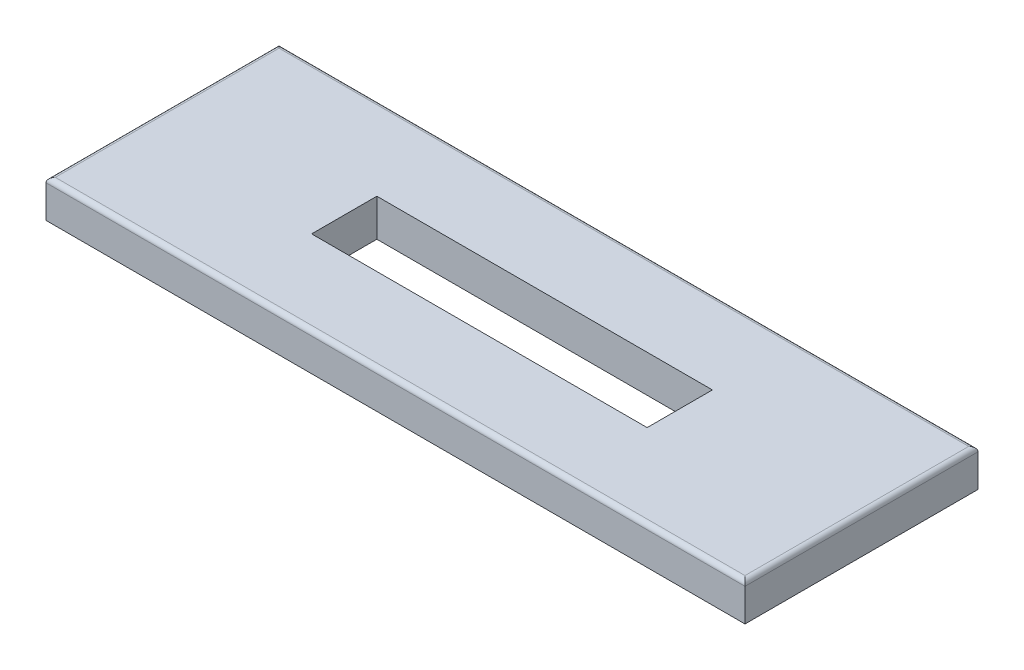
ISO-10303-21;
HEADER;
FILE_DESCRIPTION(('STEP AP214'),'2;1');
FILE_NAME('part.step','',(''),(''),'','','');
FILE_SCHEMA(('AUTOMOTIVE_DESIGN { 1 0 10303 214 1 1 1 1 }'));
ENDSEC;
DATA;
#1=APPLICATION_CONTEXT('core data for automotive mechanical design processes');
#2=APPLICATION_PROTOCOL_DEFINITION('international standard','automotive_design',2000,#1);
#3=PRODUCT_CONTEXT('',#1,'mechanical');
#4=PRODUCT('Part','Part','',(#3));
#5=PRODUCT_RELATED_PRODUCT_CATEGORY('part','',(#4));
#6=PRODUCT_DEFINITION_FORMATION('','',#4);
#7=PRODUCT_DEFINITION_CONTEXT('part definition',#1,'design');
#8=PRODUCT_DEFINITION('design','',#6,#7);
#9=PRODUCT_DEFINITION_SHAPE('','',#8);
#10=(LENGTH_UNIT() NAMED_UNIT(*) SI_UNIT(.MILLI.,.METRE.));
#11=(NAMED_UNIT(*) PLANE_ANGLE_UNIT() SI_UNIT($,.RADIAN.));
#12=(NAMED_UNIT(*) SI_UNIT($,.STERADIAN.) SOLID_ANGLE_UNIT());
#13=UNCERTAINTY_MEASURE_WITH_UNIT(LENGTH_MEASURE(1.E-05),#10,'distance_accuracy_value','');
#14=(GEOMETRIC_REPRESENTATION_CONTEXT(3) GLOBAL_UNCERTAINTY_ASSIGNED_CONTEXT((#13)) GLOBAL_UNIT_ASSIGNED_CONTEXT((#10,
#11,#12)) REPRESENTATION_CONTEXT('',''));
#15=CARTESIAN_POINT('',(0.,0.,0.));
#16=DIRECTION('',(0.,0.,1.));
#17=DIRECTION('',(1.,0.,0.));
#18=AXIS2_PLACEMENT_3D('',#15,#16,#17);
#19=CARTESIAN_POINT('',(0.,80.,0.));
#20=DIRECTION('',(0.,1.,0.));
#21=DIRECTION('',(0.,0.,1.));
#22=AXIS2_PLACEMENT_3D('',#19,#20,#21);
#23=PLANE('',#22);
#24=DIRECTION('',(0.,0.,1.));
#25=VECTOR('',#24,1.);
#26=CARTESIAN_POINT('',(-740.,80.,250.));
#27=LINE('',#26,#25);
#28=CARTESIAN_POINT('',(-740.,80.,-240.));
#29=VERTEX_POINT('',#28);
#30=CARTESIAN_POINT('',(-740.,80.,240.));
#31=VERTEX_POINT('',#30);
#32=EDGE_CURVE('E174',#29,#31,#27,.T.);
#33=ORIENTED_EDGE('',*,*,#32,.T.);
#34=DIRECTION('',(1.,0.,0.));
#35=VECTOR('',#34,1.);
#36=CARTESIAN_POINT('',(750.,80.,240.));
#37=LINE('',#36,#35);
#38=CARTESIAN_POINT('',(740.,80.,240.));
#39=VERTEX_POINT('',#38);
#40=EDGE_CURVE('E176',#31,#39,#37,.T.);
#41=ORIENTED_EDGE('',*,*,#40,.T.);
#42=DIRECTION('',(0.,0.,-1.));
#43=VECTOR('',#42,1.);
#44=CARTESIAN_POINT('',(740.,80.,-250.));
#45=LINE('',#44,#43);
#46=CARTESIAN_POINT('',(740.,80.,-240.));
#47=VERTEX_POINT('',#46);
#48=EDGE_CURVE('E170',#39,#47,#45,.T.);
#49=ORIENTED_EDGE('',*,*,#48,.T.);
#50=DIRECTION('',(-1.,0.,0.));
#51=VECTOR('',#50,1.);
#52=CARTESIAN_POINT('',(-750.,80.,-240.));
#53=LINE('',#52,#51);
#54=EDGE_CURVE('E172',#47,#29,#53,.T.);
#55=ORIENTED_EDGE('',*,*,#54,.T.);
#56=EDGE_LOOP('',(#33,#41,#49,#55));
#57=FACE_BOUND('',#56,.T.);
#58=DIRECTION('',(-1.,0.,0.));
#59=VECTOR('',#58,1.);
#60=CARTESIAN_POINT('',(-360.,80.,-70.));
#61=LINE('',#60,#59);
#62=CARTESIAN_POINT('',(360.,80.,-70.));
#63=VERTEX_POINT('',#62);
#64=CARTESIAN_POINT('',(-360.,80.,-70.));
#65=VERTEX_POINT('',#64);
#66=EDGE_CURVE('E122',#63,#65,#61,.T.);
#67=ORIENTED_EDGE('',*,*,#66,.F.);
#68=DIRECTION('',(0.,0.,-1.));
#69=VECTOR('',#68,1.);
#70=CARTESIAN_POINT('',(360.,80.,-70.));
#71=LINE('',#70,#69);
#72=CARTESIAN_POINT('',(360.,80.,70.));
#73=VERTEX_POINT('',#72);
#74=EDGE_CURVE('E114',#73,#63,#71,.T.);
#75=ORIENTED_EDGE('',*,*,#74,.F.);
#76=DIRECTION('',(1.,0.,0.));
#77=VECTOR('',#76,1.);
#78=CARTESIAN_POINT('',(-360.,80.,70.));
#79=LINE('',#78,#77);
#80=CARTESIAN_POINT('',(-360.,80.,70.));
#81=VERTEX_POINT('',#80);
#82=EDGE_CURVE('E136',#81,#73,#79,.T.);
#83=ORIENTED_EDGE('',*,*,#82,.F.);
#84=DIRECTION('',(0.,0.,1.));
#85=VECTOR('',#84,1.);
#86=CARTESIAN_POINT('',(-360.,80.,-70.));
#87=LINE('',#86,#85);
#88=EDGE_CURVE('E134',#65,#81,#87,.T.);
#89=ORIENTED_EDGE('',*,*,#88,.F.);
#90=EDGE_LOOP('',(#67,#75,#83,#89));
#91=FACE_BOUND('',#90,.T.);
#92=ADVANCED_FACE('F36',(#57,#91),#23,.T.);
#93=CARTESIAN_POINT('',(0.,0.,0.));
#94=DIRECTION('',(0.,1.,0.));
#95=DIRECTION('',(0.,0.,1.));
#96=AXIS2_PLACEMENT_3D('',#93,#94,#95);
#97=PLANE('',#96);
#98=DIRECTION('',(0.,0.,-1.));
#99=VECTOR('',#98,1.);
#100=CARTESIAN_POINT('',(750.,0.,-250.));
#101=LINE('',#100,#99);
#102=CARTESIAN_POINT('',(750.,0.,250.));
#103=VERTEX_POINT('',#102);
#104=CARTESIAN_POINT('',(750.,0.,-250.));
#105=VERTEX_POINT('',#104);
#106=EDGE_CURVE('E150',#103,#105,#101,.T.);
#107=ORIENTED_EDGE('',*,*,#106,.F.);
#108=DIRECTION('',(1.,0.,0.));
#109=VECTOR('',#108,1.);
#110=CARTESIAN_POINT('',(-750.,0.,250.));
#111=LINE('',#110,#109);
#112=CARTESIAN_POINT('',(-750.,0.,250.));
#113=VERTEX_POINT('',#112);
#114=EDGE_CURVE('E159',#113,#103,#111,.T.);
#115=ORIENTED_EDGE('',*,*,#114,.F.);
#116=DIRECTION('',(0.,0.,1.));
#117=VECTOR('',#116,1.);
#118=CARTESIAN_POINT('',(-750.,0.,-250.));
#119=LINE('',#118,#117);
#120=CARTESIAN_POINT('',(-750.,0.,-250.));
#121=VERTEX_POINT('',#120);
#122=EDGE_CURVE('E156',#121,#113,#119,.T.);
#123=ORIENTED_EDGE('',*,*,#122,.F.);
#124=DIRECTION('',(-1.,0.,0.));
#125=VECTOR('',#124,1.);
#126=CARTESIAN_POINT('',(-750.,0.,-250.));
#127=LINE('',#126,#125);
#128=EDGE_CURVE('E153',#105,#121,#127,.T.);
#129=ORIENTED_EDGE('',*,*,#128,.F.);
#130=EDGE_LOOP('',(#107,#115,#123,#129));
#131=FACE_BOUND('',#130,.T.);
#132=DIRECTION('',(0.,0.,-1.));
#133=VECTOR('',#132,1.);
#134=CARTESIAN_POINT('',(360.,0.,-70.));
#135=LINE('',#134,#133);
#136=CARTESIAN_POINT('',(360.,0.,70.));
#137=VERTEX_POINT('',#136);
#138=CARTESIAN_POINT('',(360.,0.,-70.));
#139=VERTEX_POINT('',#138);
#140=EDGE_CURVE('E61',#137,#139,#135,.T.);
#141=ORIENTED_EDGE('',*,*,#140,.T.);
#142=DIRECTION('',(-1.,0.,0.));
#143=VECTOR('',#142,1.);
#144=CARTESIAN_POINT('',(-360.,0.,-70.));
#145=LINE('',#144,#143);
#146=CARTESIAN_POINT('',(-360.,0.,-70.));
#147=VERTEX_POINT('',#146);
#148=EDGE_CURVE('E129',#139,#147,#145,.T.);
#149=ORIENTED_EDGE('',*,*,#148,.T.);
#150=DIRECTION('',(0.,0.,1.));
#151=VECTOR('',#150,1.);
#152=CARTESIAN_POINT('',(-360.,0.,-70.));
#153=LINE('',#152,#151);
#154=CARTESIAN_POINT('',(-360.,0.,70.));
#155=VERTEX_POINT('',#154);
#156=EDGE_CURVE('E142',#147,#155,#153,.T.);
#157=ORIENTED_EDGE('',*,*,#156,.T.);
#158=DIRECTION('',(1.,0.,0.));
#159=VECTOR('',#158,1.);
#160=CARTESIAN_POINT('',(-360.,0.,70.));
#161=LINE('',#160,#159);
#162=EDGE_CURVE('E123',#155,#137,#161,.T.);
#163=ORIENTED_EDGE('',*,*,#162,.T.);
#164=EDGE_LOOP('',(#141,#149,#157,#163));
#165=FACE_BOUND('',#164,.T.);
#166=ADVANCED_FACE('F214',(#131,#165),#97,.F.);
#167=CARTESIAN_POINT('',(750.,80.,-250.));
#168=DIRECTION('',(-1.,0.,0.));
#169=DIRECTION('',(0.,0.,1.));
#170=AXIS2_PLACEMENT_3D('',#167,#168,#169);
#171=PLANE('',#170);
#172=DIRECTION('',(0.,-1.,0.));
#173=VECTOR('',#172,1.);
#174=CARTESIAN_POINT('',(750.,80.,-250.));
#175=LINE('',#174,#173);
#176=CARTESIAN_POINT('',(750.,70.,-250.));
#177=VERTEX_POINT('',#176);
#178=EDGE_CURVE('E168',#177,#105,#175,.T.);
#179=ORIENTED_EDGE('',*,*,#178,.F.);
#180=DIRECTION('',(0.,0.,-1.));
#181=VECTOR('',#180,1.);
#182=CARTESIAN_POINT('',(750.,70.,250.));
#183=LINE('',#182,#181);
#184=CARTESIAN_POINT('',(750.,70.,250.));
#185=VERTEX_POINT('',#184);
#186=EDGE_CURVE('E11',#177,#185,#183,.F.);
#187=ORIENTED_EDGE('',*,*,#186,.T.);
#188=DIRECTION('',(0.,-1.,0.));
#189=VECTOR('',#188,1.);
#190=CARTESIAN_POINT('',(750.,80.,250.));
#191=LINE('',#190,#189);
#192=EDGE_CURVE('E162',#185,#103,#191,.T.);
#193=ORIENTED_EDGE('',*,*,#192,.T.);
#194=ORIENTED_EDGE('',*,*,#106,.T.);
#195=EDGE_LOOP('',(#179,#187,#193,#194));
#196=FACE_BOUND('',#195,.T.);
#197=ADVANCED_FACE('F209',(#196),#171,.F.);
#198=CARTESIAN_POINT('',(-750.,80.,-250.));
#199=DIRECTION('',(0.,0.,1.));
#200=DIRECTION('',(1.,0.,0.));
#201=AXIS2_PLACEMENT_3D('',#198,#199,#200);
#202=PLANE('',#201);
#203=DIRECTION('',(0.,-1.,0.));
#204=VECTOR('',#203,1.);
#205=CARTESIAN_POINT('',(-750.,80.,-250.));
#206=LINE('',#205,#204);
#207=CARTESIAN_POINT('',(-750.,70.,-250.));
#208=VERTEX_POINT('',#207);
#209=EDGE_CURVE('E166',#208,#121,#206,.T.);
#210=ORIENTED_EDGE('',*,*,#209,.F.);
#211=DIRECTION('',(-1.,0.,0.));
#212=VECTOR('',#211,1.);
#213=CARTESIAN_POINT('',(750.,70.,-250.));
#214=LINE('',#213,#212);
#215=EDGE_CURVE('E45',#208,#177,#214,.F.);
#216=ORIENTED_EDGE('',*,*,#215,.T.);
#217=ORIENTED_EDGE('',*,*,#178,.T.);
#218=ORIENTED_EDGE('',*,*,#128,.T.);
#219=EDGE_LOOP('',(#210,#216,#217,#218));
#220=FACE_BOUND('',#219,.T.);
#221=ADVANCED_FACE('F206',(#220),#202,.F.);
#222=CARTESIAN_POINT('',(-750.,80.,-250.));
#223=DIRECTION('',(1.,0.,0.));
#224=DIRECTION('',(0.,0.,-1.));
#225=AXIS2_PLACEMENT_3D('',#222,#223,#224);
#226=PLANE('',#225);
#227=DIRECTION('',(0.,-1.,0.));
#228=VECTOR('',#227,1.);
#229=CARTESIAN_POINT('',(-750.,80.,250.));
#230=LINE('',#229,#228);
#231=CARTESIAN_POINT('',(-750.,70.,250.));
#232=VERTEX_POINT('',#231);
#233=EDGE_CURVE('E164',#232,#113,#230,.T.);
#234=ORIENTED_EDGE('',*,*,#233,.F.);
#235=DIRECTION('',(0.,0.,1.));
#236=VECTOR('',#235,1.);
#237=CARTESIAN_POINT('',(-750.,70.,-250.));
#238=LINE('',#237,#236);
#239=EDGE_CURVE('E182',#232,#208,#238,.F.);
#240=ORIENTED_EDGE('',*,*,#239,.T.);
#241=ORIENTED_EDGE('',*,*,#209,.T.);
#242=ORIENTED_EDGE('',*,*,#122,.T.);
#243=EDGE_LOOP('',(#234,#240,#241,#242));
#244=FACE_BOUND('',#243,.T.);
#245=ADVANCED_FACE('F219',(#244),#226,.F.);
#246=CARTESIAN_POINT('',(-750.,80.,250.));
#247=DIRECTION('',(0.,0.,-1.));
#248=DIRECTION('',(-1.,0.,0.));
#249=AXIS2_PLACEMENT_3D('',#246,#247,#248);
#250=PLANE('',#249);
#251=ORIENTED_EDGE('',*,*,#192,.F.);
#252=DIRECTION('',(1.,0.,0.));
#253=VECTOR('',#252,1.);
#254=CARTESIAN_POINT('',(-750.,70.,250.));
#255=LINE('',#254,#253);
#256=EDGE_CURVE('E179',#185,#232,#255,.F.);
#257=ORIENTED_EDGE('',*,*,#256,.T.);
#258=ORIENTED_EDGE('',*,*,#233,.T.);
#259=ORIENTED_EDGE('',*,*,#114,.T.);
#260=EDGE_LOOP('',(#251,#257,#258,#259));
#261=FACE_BOUND('',#260,.T.);
#262=ADVANCED_FACE('F221',(#261),#250,.F.);
#263=CARTESIAN_POINT('',(0.,70.,-240.));
#264=DIRECTION('',(1.,0.,0.));
#265=DIRECTION('',(0.,0.,-1.));
#266=AXIS2_PLACEMENT_3D('',#263,#264,#265);
#267=CYLINDRICAL_SURFACE('',#266,10.);
#268=CARTESIAN_POINT('',(740.,70.,-240.));
#269=DIRECTION('',(0.707106781186548,0.,0.707106781186547));
#270=DIRECTION('',(-0.707106781186547,0.,0.707106781186548));
#271=AXIS2_PLACEMENT_3D('',#268,#269,#270);
#272=ELLIPSE('',#271,14.1421356237309,10.);
#273=EDGE_CURVE('E187',#177,#47,#272,.T.);
#274=ORIENTED_EDGE('',*,*,#273,.F.);
#275=ORIENTED_EDGE('',*,*,#215,.F.);
#276=CARTESIAN_POINT('',(-740.,70.,-240.));
#277=DIRECTION('',(0.707106781186547,0.,-0.707106781186548));
#278=DIRECTION('',(0.707106781186548,0.,0.707106781186547));
#279=AXIS2_PLACEMENT_3D('',#276,#277,#278);
#280=ELLIPSE('',#279,14.142135623731,10.);
#281=EDGE_CURVE('E40',#29,#208,#280,.F.);
#282=ORIENTED_EDGE('',*,*,#281,.F.);
#283=ORIENTED_EDGE('',*,*,#54,.F.);
#284=EDGE_LOOP('',(#274,#275,#282,#283));
#285=FACE_BOUND('',#284,.T.);
#286=ADVANCED_FACE('F38',(#285),#267,.T.);
#287=CARTESIAN_POINT('',(-740.,70.,1.64313007644523E-13));
#288=DIRECTION('',(0.,0.,-1.));
#289=DIRECTION('',(-1.,0.,0.));
#290=AXIS2_PLACEMENT_3D('',#287,#288,#289);
#291=CYLINDRICAL_SURFACE('',#290,10.);
#292=ORIENTED_EDGE('',*,*,#281,.T.);
#293=ORIENTED_EDGE('',*,*,#239,.F.);
#294=CARTESIAN_POINT('',(-740.,70.,240.));
#295=DIRECTION('',(-0.707106781186548,0.,-0.707106781186547));
#296=DIRECTION('',(0.707106781186547,0.,-0.707106781186548));
#297=AXIS2_PLACEMENT_3D('',#294,#295,#296);
#298=ELLIPSE('',#297,14.1421356237309,10.);
#299=EDGE_CURVE('E186',#31,#232,#298,.F.);
#300=ORIENTED_EDGE('',*,*,#299,.F.);
#301=ORIENTED_EDGE('',*,*,#32,.F.);
#302=EDGE_LOOP('',(#292,#293,#300,#301));
#303=FACE_BOUND('',#302,.T.);
#304=ADVANCED_FACE('F198',(#303),#291,.T.);
#305=CARTESIAN_POINT('',(740.,70.,-3.28626015289046E-13));
#306=DIRECTION('',(0.,0.,1.));
#307=DIRECTION('',(1.,0.,0.));
#308=AXIS2_PLACEMENT_3D('',#305,#306,#307);
#309=CYLINDRICAL_SURFACE('',#308,10.);
#310=ORIENTED_EDGE('',*,*,#273,.T.);
#311=ORIENTED_EDGE('',*,*,#48,.F.);
#312=CARTESIAN_POINT('',(740.,70.,240.));
#313=DIRECTION('',(-0.707106781186547,0.,0.707106781186548));
#314=DIRECTION('',(0.707106781186548,0.,0.707106781186547));
#315=AXIS2_PLACEMENT_3D('',#312,#313,#314);
#316=ELLIPSE('',#315,14.142135623731,10.);
#317=EDGE_CURVE('E130',#185,#39,#316,.T.);
#318=ORIENTED_EDGE('',*,*,#317,.F.);
#319=ORIENTED_EDGE('',*,*,#186,.F.);
#320=EDGE_LOOP('',(#310,#311,#318,#319));
#321=FACE_BOUND('',#320,.T.);
#322=ADVANCED_FACE('F227',(#321),#309,.T.);
#323=CARTESIAN_POINT('',(0.,70.,240.));
#324=DIRECTION('',(-1.,0.,0.));
#325=DIRECTION('',(0.,0.,1.));
#326=AXIS2_PLACEMENT_3D('',#323,#324,#325);
#327=CYLINDRICAL_SURFACE('',#326,10.);
#328=ORIENTED_EDGE('',*,*,#299,.T.);
#329=ORIENTED_EDGE('',*,*,#256,.F.);
#330=ORIENTED_EDGE('',*,*,#317,.T.);
#331=ORIENTED_EDGE('',*,*,#40,.F.);
#332=EDGE_LOOP('',(#328,#329,#330,#331));
#333=FACE_BOUND('',#332,.T.);
#334=ADVANCED_FACE('F225',(#333),#327,.T.);
#335=CARTESIAN_POINT('',(360.,80.,-70.));
#336=DIRECTION('',(-1.,0.,0.));
#337=DIRECTION('',(0.,0.,1.));
#338=AXIS2_PLACEMENT_3D('',#335,#336,#337);
#339=PLANE('',#338);
#340=ORIENTED_EDGE('',*,*,#140,.F.);
#341=DIRECTION('',(0.,-1.,0.));
#342=VECTOR('',#341,1.);
#343=CARTESIAN_POINT('',(360.,80.,70.));
#344=LINE('',#343,#342);
#345=EDGE_CURVE('E118',#73,#137,#344,.T.);
#346=ORIENTED_EDGE('',*,*,#345,.F.);
#347=ORIENTED_EDGE('',*,*,#74,.T.);
#348=DIRECTION('',(0.,-1.,0.));
#349=VECTOR('',#348,1.);
#350=CARTESIAN_POINT('',(360.,80.,-70.));
#351=LINE('',#350,#349);
#352=EDGE_CURVE('E117',#63,#139,#351,.T.);
#353=ORIENTED_EDGE('',*,*,#352,.T.);
#354=EDGE_LOOP('',(#340,#346,#347,#353));
#355=FACE_BOUND('',#354,.T.);
#356=ADVANCED_FACE('F116',(#355),#339,.T.);
#357=CARTESIAN_POINT('',(-360.,80.,-70.));
#358=DIRECTION('',(0.,0.,1.));
#359=DIRECTION('',(1.,0.,0.));
#360=AXIS2_PLACEMENT_3D('',#357,#358,#359);
#361=PLANE('',#360);
#362=ORIENTED_EDGE('',*,*,#148,.F.);
#363=ORIENTED_EDGE('',*,*,#352,.F.);
#364=ORIENTED_EDGE('',*,*,#66,.T.);
#365=DIRECTION('',(0.,-1.,0.));
#366=VECTOR('',#365,1.);
#367=CARTESIAN_POINT('',(-360.,80.,-70.));
#368=LINE('',#367,#366);
#369=EDGE_CURVE('E131',#65,#147,#368,.T.);
#370=ORIENTED_EDGE('',*,*,#369,.T.);
#371=EDGE_LOOP('',(#362,#363,#364,#370));
#372=FACE_BOUND('',#371,.T.);
#373=ADVANCED_FACE('F126',(#372),#361,.T.);
#374=CARTESIAN_POINT('',(-360.,80.,-70.));
#375=DIRECTION('',(1.,0.,0.));
#376=DIRECTION('',(0.,0.,-1.));
#377=AXIS2_PLACEMENT_3D('',#374,#375,#376);
#378=PLANE('',#377);
#379=ORIENTED_EDGE('',*,*,#156,.F.);
#380=ORIENTED_EDGE('',*,*,#369,.F.);
#381=ORIENTED_EDGE('',*,*,#88,.T.);
#382=DIRECTION('',(0.,-1.,0.));
#383=VECTOR('',#382,1.);
#384=CARTESIAN_POINT('',(-360.,80.,70.));
#385=LINE('',#384,#383);
#386=EDGE_CURVE('E53',#81,#155,#385,.T.);
#387=ORIENTED_EDGE('',*,*,#386,.T.);
#388=EDGE_LOOP('',(#379,#380,#381,#387));
#389=FACE_BOUND('',#388,.T.);
#390=ADVANCED_FACE('F341',(#389),#378,.T.);
#391=CARTESIAN_POINT('',(-360.,80.,70.));
#392=DIRECTION('',(0.,0.,-1.));
#393=DIRECTION('',(-1.,0.,0.));
#394=AXIS2_PLACEMENT_3D('',#391,#392,#393);
#395=PLANE('',#394);
#396=ORIENTED_EDGE('',*,*,#162,.F.);
#397=ORIENTED_EDGE('',*,*,#386,.F.);
#398=ORIENTED_EDGE('',*,*,#82,.T.);
#399=ORIENTED_EDGE('',*,*,#345,.T.);
#400=EDGE_LOOP('',(#396,#397,#398,#399));
#401=FACE_BOUND('',#400,.T.);
#402=ADVANCED_FACE('F350',(#401),#395,.T.);
#403=CLOSED_SHELL('',(#92,#166,#197,#221,#245,#262,#286,#304,#322,#334,#356,#373,#390,#402));
#404=MANIFOLD_SOLID_BREP('B2',#403);
#405=ADVANCED_BREP_SHAPE_REPRESENTATION('',(#18,#404),#14);
#406=SHAPE_DEFINITION_REPRESENTATION(#9,#405);
ENDSEC;
END-ISO-10303-21;
